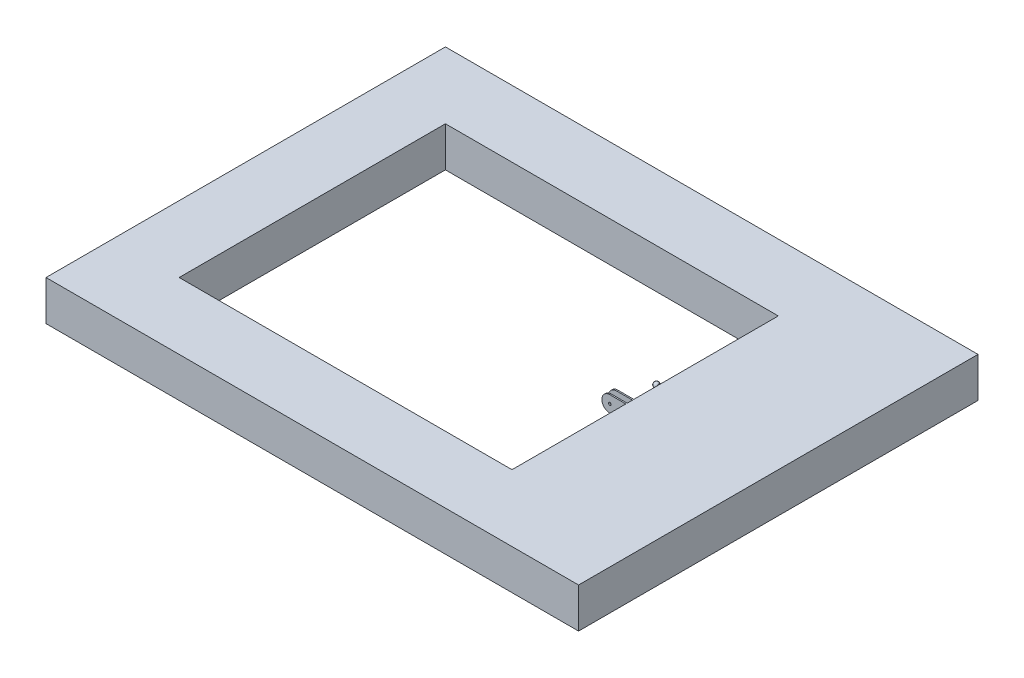
ISO-10303-21;
HEADER;
FILE_DESCRIPTION(('STEP AP214'),'2;1');
FILE_NAME('part.step','',(''),(''),'','','');
FILE_SCHEMA(('AUTOMOTIVE_DESIGN { 1 0 10303 214 1 1 1 1 }'));
ENDSEC;
DATA;
#1=APPLICATION_CONTEXT('core data for automotive mechanical design processes');
#2=APPLICATION_PROTOCOL_DEFINITION('international standard','automotive_design',2000,#1);
#3=PRODUCT_CONTEXT('',#1,'mechanical');
#4=PRODUCT('Part','Part','',(#3));
#5=PRODUCT_RELATED_PRODUCT_CATEGORY('part','',(#4));
#6=PRODUCT_DEFINITION_FORMATION('','',#4);
#7=PRODUCT_DEFINITION_CONTEXT('part definition',#1,'design');
#8=PRODUCT_DEFINITION('design','',#6,#7);
#9=PRODUCT_DEFINITION_SHAPE('','',#8);
#10=(LENGTH_UNIT() NAMED_UNIT(*) SI_UNIT(.MILLI.,.METRE.));
#11=(NAMED_UNIT(*) PLANE_ANGLE_UNIT() SI_UNIT($,.RADIAN.));
#12=(NAMED_UNIT(*) SI_UNIT($,.STERADIAN.) SOLID_ANGLE_UNIT());
#13=UNCERTAINTY_MEASURE_WITH_UNIT(LENGTH_MEASURE(1.E-05),#10,'distance_accuracy_value','');
#14=(GEOMETRIC_REPRESENTATION_CONTEXT(3) GLOBAL_UNCERTAINTY_ASSIGNED_CONTEXT((#13)) GLOBAL_UNIT_ASSIGNED_CONTEXT((#10,
#11,#12)) REPRESENTATION_CONTEXT('',''));
#15=CARTESIAN_POINT('',(0.,0.,0.));
#16=DIRECTION('',(0.,0.,1.));
#17=DIRECTION('',(1.,0.,0.));
#18=AXIS2_PLACEMENT_3D('',#15,#16,#17);
#19=CARTESIAN_POINT('',(0.,0.,3000.));
#20=DIRECTION('',(1.,0.,0.));
#21=DIRECTION('',(0.,0.,-1.));
#22=AXIS2_PLACEMENT_3D('',#19,#20,#21);
#23=PLANE('',#22);
#24=DIRECTION('',(0.,-1.,0.));
#25=VECTOR('',#24,1.);
#26=CARTESIAN_POINT('',(0.,0.,0.));
#27=LINE('',#26,#25);
#28=CARTESIAN_POINT('',(0.,300.,0.));
#29=VERTEX_POINT('',#28);
#30=CARTESIAN_POINT('',(0.,0.,0.));
#31=VERTEX_POINT('',#30);
#32=EDGE_CURVE('E300',#29,#31,#27,.T.);
#33=ORIENTED_EDGE('',*,*,#32,.T.);
#34=DIRECTION('',(0.,0.,-1.));
#35=VECTOR('',#34,1.);
#36=CARTESIAN_POINT('',(0.,0.,3000.));
#37=LINE('',#36,#35);
#38=CARTESIAN_POINT('',(0.,0.,3000.));
#39=VERTEX_POINT('',#38);
#40=EDGE_CURVE('E11',#39,#31,#37,.T.);
#41=ORIENTED_EDGE('',*,*,#40,.F.);
#42=DIRECTION('',(0.,-1.,0.));
#43=VECTOR('',#42,1.);
#44=CARTESIAN_POINT('',(0.,0.,3000.));
#45=LINE('',#44,#43);
#46=CARTESIAN_POINT('',(0.,300.,3000.));
#47=VERTEX_POINT('',#46);
#48=EDGE_CURVE('E320',#47,#39,#45,.T.);
#49=ORIENTED_EDGE('',*,*,#48,.F.);
#50=DIRECTION('',(0.,0.,-1.));
#51=VECTOR('',#50,1.);
#52=CARTESIAN_POINT('',(0.,300.,3000.));
#53=LINE('',#52,#51);
#54=EDGE_CURVE('E303',#47,#29,#53,.T.);
#55=ORIENTED_EDGE('',*,*,#54,.T.);
#56=EDGE_LOOP('',(#33,#41,#49,#55));
#57=FACE_BOUND('',#56,.T.);
#58=ADVANCED_FACE('F37',(#57),#23,.F.);
#59=CARTESIAN_POINT('',(0.,0.,3000.));
#60=DIRECTION('',(0.,1.,0.));
#61=DIRECTION('',(0.,0.,1.));
#62=AXIS2_PLACEMENT_3D('',#59,#60,#61);
#63=PLANE('',#62);
#64=DIRECTION('',(-1.,0.,0.));
#65=VECTOR('',#64,1.);
#66=CARTESIAN_POINT('',(0.,0.,500.));
#67=LINE('',#66,#65);
#68=CARTESIAN_POINT('',(3000.,0.,500.));
#69=VERTEX_POINT('',#68);
#70=CARTESIAN_POINT('',(500.,0.,500.));
#71=VERTEX_POINT('',#70);
#72=EDGE_CURVE('E311',#69,#71,#67,.T.);
#73=ORIENTED_EDGE('',*,*,#72,.T.);
#74=DIRECTION('',(0.,0.,1.));
#75=VECTOR('',#74,1.);
#76=CARTESIAN_POINT('',(500.,0.,3000.));
#77=LINE('',#76,#75);
#78=CARTESIAN_POINT('',(500.,0.,2500.));
#79=VERTEX_POINT('',#78);
#80=EDGE_CURVE('E307',#71,#79,#77,.T.);
#81=ORIENTED_EDGE('',*,*,#80,.T.);
#82=DIRECTION('',(1.,0.,0.));
#83=VECTOR('',#82,1.);
#84=CARTESIAN_POINT('',(0.,0.,2500.));
#85=LINE('',#84,#83);
#86=CARTESIAN_POINT('',(3000.,0.,2500.));
#87=VERTEX_POINT('',#86);
#88=EDGE_CURVE('E256',#79,#87,#85,.T.);
#89=ORIENTED_EDGE('',*,*,#88,.T.);
#90=DIRECTION('',(0.,0.,-1.));
#91=VECTOR('',#90,1.);
#92=CARTESIAN_POINT('',(3000.,0.,3000.));
#93=LINE('',#92,#91);
#94=EDGE_CURVE('E342',#87,#69,#93,.T.);
#95=ORIENTED_EDGE('',*,*,#94,.T.);
#96=EDGE_LOOP('',(#73,#81,#89,#95));
#97=FACE_BOUND('',#96,.T.);
#98=DIRECTION('',(1.,0.,0.));
#99=VECTOR('',#98,1.);
#100=CARTESIAN_POINT('',(0.,0.,0.));
#101=LINE('',#100,#99);
#102=CARTESIAN_POINT('',(4000.,0.,0.));
#103=VERTEX_POINT('',#102);
#104=EDGE_CURVE('E306',#31,#103,#101,.T.);
#105=ORIENTED_EDGE('',*,*,#104,.T.);
#106=DIRECTION('',(0.,0.,-1.));
#107=VECTOR('',#106,1.);
#108=CARTESIAN_POINT('',(4000.,0.,3000.));
#109=LINE('',#108,#107);
#110=CARTESIAN_POINT('',(4000.,0.,3000.));
#111=VERTEX_POINT('',#110);
#112=EDGE_CURVE('E44',#111,#103,#109,.T.);
#113=ORIENTED_EDGE('',*,*,#112,.F.);
#114=DIRECTION('',(1.,0.,0.));
#115=VECTOR('',#114,1.);
#116=CARTESIAN_POINT('',(0.,0.,3000.));
#117=LINE('',#116,#115);
#118=EDGE_CURVE('E336',#39,#111,#117,.T.);
#119=ORIENTED_EDGE('',*,*,#118,.F.);
#120=ORIENTED_EDGE('',*,*,#40,.T.);
#121=EDGE_LOOP('',(#105,#113,#119,#120));
#122=FACE_BOUND('',#121,.T.);
#123=ADVANCED_FACE('F289',(#97,#122),#63,.F.);
#124=CARTESIAN_POINT('',(4000.,0.,3000.));
#125=DIRECTION('',(-1.,0.,0.));
#126=DIRECTION('',(0.,0.,1.));
#127=AXIS2_PLACEMENT_3D('',#124,#125,#126);
#128=PLANE('',#127);
#129=DIRECTION('',(0.,1.,0.));
#130=VECTOR('',#129,1.);
#131=CARTESIAN_POINT('',(4000.,0.,0.));
#132=LINE('',#131,#130);
#133=CARTESIAN_POINT('',(4000.,300.,0.));
#134=VERTEX_POINT('',#133);
#135=EDGE_CURVE('E309',#103,#134,#132,.T.);
#136=ORIENTED_EDGE('',*,*,#135,.T.);
#137=DIRECTION('',(0.,0.,-1.));
#138=VECTOR('',#137,1.);
#139=CARTESIAN_POINT('',(4000.,300.,3000.));
#140=LINE('',#139,#138);
#141=CARTESIAN_POINT('',(4000.,300.,3000.));
#142=VERTEX_POINT('',#141);
#143=EDGE_CURVE('E322',#142,#134,#140,.T.);
#144=ORIENTED_EDGE('',*,*,#143,.F.);
#145=DIRECTION('',(0.,1.,0.));
#146=VECTOR('',#145,1.);
#147=CARTESIAN_POINT('',(4000.,0.,3000.));
#148=LINE('',#147,#146);
#149=EDGE_CURVE('E330',#111,#142,#148,.T.);
#150=ORIENTED_EDGE('',*,*,#149,.F.);
#151=ORIENTED_EDGE('',*,*,#112,.T.);
#152=EDGE_LOOP('',(#136,#144,#150,#151));
#153=FACE_BOUND('',#152,.T.);
#154=ADVANCED_FACE('F294',(#153),#128,.F.);
#155=CARTESIAN_POINT('',(0.,300.,3000.));
#156=DIRECTION('',(0.,-1.,0.));
#157=DIRECTION('',(0.,0.,-1.));
#158=AXIS2_PLACEMENT_3D('',#155,#156,#157);
#159=PLANE('',#158);
#160=DIRECTION('',(1.,0.,0.));
#161=VECTOR('',#160,1.);
#162=CARTESIAN_POINT('',(500.,300.,2500.));
#163=LINE('',#162,#161);
#164=CARTESIAN_POINT('',(500.,300.,2500.));
#165=VERTEX_POINT('',#164);
#166=CARTESIAN_POINT('',(3000.,300.,2500.));
#167=VERTEX_POINT('',#166);
#168=EDGE_CURVE('E168',#165,#167,#163,.T.);
#169=ORIENTED_EDGE('',*,*,#168,.F.);
#170=DIRECTION('',(0.,0.,1.));
#171=VECTOR('',#170,1.);
#172=CARTESIAN_POINT('',(500.,300.,500.));
#173=LINE('',#172,#171);
#174=CARTESIAN_POINT('',(500.,300.,500.));
#175=VERTEX_POINT('',#174);
#176=EDGE_CURVE('E171',#175,#165,#173,.T.);
#177=ORIENTED_EDGE('',*,*,#176,.F.);
#178=DIRECTION('',(-1.,0.,0.));
#179=VECTOR('',#178,1.);
#180=CARTESIAN_POINT('',(500.,300.,500.));
#181=LINE('',#180,#179);
#182=CARTESIAN_POINT('',(3000.,300.,500.));
#183=VERTEX_POINT('',#182);
#184=EDGE_CURVE('E165',#183,#175,#181,.T.);
#185=ORIENTED_EDGE('',*,*,#184,.F.);
#186=DIRECTION('',(0.,0.,-1.));
#187=VECTOR('',#186,1.);
#188=CARTESIAN_POINT('',(3000.,300.,500.));
#189=LINE('',#188,#187);
#190=CARTESIAN_POINT('',(3000.,300.,1385.));
#191=VERTEX_POINT('',#190);
#192=EDGE_CURVE('E157',#191,#183,#189,.T.);
#193=ORIENTED_EDGE('',*,*,#192,.F.);
#194=CARTESIAN_POINT('',(3000.,300.,1585.));
#195=VERTEX_POINT('',#194);
#196=EDGE_CURVE('E148',#195,#191,#189,.T.);
#197=ORIENTED_EDGE('',*,*,#196,.F.);
#198=DIRECTION('',(1.,0.,0.));
#199=VECTOR('',#198,1.);
#200=CARTESIAN_POINT('',(2880.,300.,1585.));
#201=LINE('',#200,#199);
#202=CARTESIAN_POINT('',(2880.,300.,1585.));
#203=VERTEX_POINT('',#202);
#204=EDGE_CURVE('E209',#203,#195,#201,.T.);
#205=ORIENTED_EDGE('',*,*,#204,.F.);
#206=DIRECTION('',(0.,0.,1.));
#207=VECTOR('',#206,1.);
#208=CARTESIAN_POINT('',(2880.,300.,1585.));
#209=LINE('',#208,#207);
#210=CARTESIAN_POINT('',(2880.,300.,1595.));
#211=VERTEX_POINT('',#210);
#212=EDGE_CURVE('E196',#203,#211,#209,.T.);
#213=ORIENTED_EDGE('',*,*,#212,.T.);
#214=DIRECTION('',(1.,0.,0.));
#215=VECTOR('',#214,1.);
#216=CARTESIAN_POINT('',(2880.,300.,1595.));
#217=LINE('',#216,#215);
#218=CARTESIAN_POINT('',(3000.,300.,1595.));
#219=VERTEX_POINT('',#218);
#220=EDGE_CURVE('E191',#211,#219,#217,.T.);
#221=ORIENTED_EDGE('',*,*,#220,.T.);
#222=CARTESIAN_POINT('',(3000.,300.,1635.));
#223=VERTEX_POINT('',#222);
#224=EDGE_CURVE('E156',#223,#219,#189,.T.);
#225=ORIENTED_EDGE('',*,*,#224,.F.);
#226=DIRECTION('',(1.,0.,0.));
#227=VECTOR('',#226,1.);
#228=CARTESIAN_POINT('',(2880.,300.,1635.));
#229=LINE('',#228,#227);
#230=CARTESIAN_POINT('',(2880.,300.,1635.));
#231=VERTEX_POINT('',#230);
#232=EDGE_CURVE('E222',#231,#223,#229,.T.);
#233=ORIENTED_EDGE('',*,*,#232,.F.);
#234=DIRECTION('',(0.,0.,1.));
#235=VECTOR('',#234,1.);
#236=CARTESIAN_POINT('',(2880.,300.,1635.));
#237=LINE('',#236,#235);
#238=CARTESIAN_POINT('',(2880.,300.,1645.));
#239=VERTEX_POINT('',#238);
#240=EDGE_CURVE('E230',#231,#239,#237,.T.);
#241=ORIENTED_EDGE('',*,*,#240,.T.);
#242=DIRECTION('',(1.,0.,0.));
#243=VECTOR('',#242,1.);
#244=CARTESIAN_POINT('',(2880.,300.,1645.));
#245=LINE('',#244,#243);
#246=CARTESIAN_POINT('',(3000.,300.,1645.));
#247=VERTEX_POINT('',#246);
#248=EDGE_CURVE('E219',#239,#247,#245,.T.);
#249=ORIENTED_EDGE('',*,*,#248,.T.);
#250=EDGE_CURVE('E169',#167,#247,#189,.T.);
#251=ORIENTED_EDGE('',*,*,#250,.F.);
#252=EDGE_LOOP('',(#169,#177,#185,#193,#197,#205,#213,#221,#225,#233,#241,#249,#251));
#253=FACE_BOUND('',#252,.T.);
#254=DIRECTION('',(-1.,0.,0.));
#255=VECTOR('',#254,1.);
#256=CARTESIAN_POINT('',(0.,300.,0.));
#257=LINE('',#256,#255);
#258=EDGE_CURVE('E318',#134,#29,#257,.T.);
#259=ORIENTED_EDGE('',*,*,#258,.T.);
#260=ORIENTED_EDGE('',*,*,#54,.F.);
#261=DIRECTION('',(-1.,0.,0.));
#262=VECTOR('',#261,1.);
#263=CARTESIAN_POINT('',(0.,300.,3000.));
#264=LINE('',#263,#262);
#265=EDGE_CURVE('E314',#142,#47,#264,.T.);
#266=ORIENTED_EDGE('',*,*,#265,.F.);
#267=ORIENTED_EDGE('',*,*,#143,.T.);
#268=EDGE_LOOP('',(#259,#260,#266,#267));
#269=FACE_BOUND('',#268,.T.);
#270=ADVANCED_FACE('F161',(#253,#269),#159,.F.);
#271=CARTESIAN_POINT('',(0.,0.,3000.));
#272=DIRECTION('',(0.,0.,-1.));
#273=DIRECTION('',(-1.,0.,0.));
#274=AXIS2_PLACEMENT_3D('',#271,#272,#273);
#275=PLANE('',#274);
#276=ORIENTED_EDGE('',*,*,#48,.T.);
#277=ORIENTED_EDGE('',*,*,#118,.T.);
#278=ORIENTED_EDGE('',*,*,#149,.T.);
#279=ORIENTED_EDGE('',*,*,#265,.T.);
#280=EDGE_LOOP('',(#276,#277,#278,#279));
#281=FACE_BOUND('',#280,.T.);
#282=ADVANCED_FACE('F352',(#281),#275,.F.);
#283=CARTESIAN_POINT('',(0.,0.,0.));
#284=DIRECTION('',(0.,0.,-1.));
#285=DIRECTION('',(-1.,0.,0.));
#286=AXIS2_PLACEMENT_3D('',#283,#284,#285);
#287=PLANE('',#286);
#288=ORIENTED_EDGE('',*,*,#32,.F.);
#289=ORIENTED_EDGE('',*,*,#258,.F.);
#290=ORIENTED_EDGE('',*,*,#135,.F.);
#291=ORIENTED_EDGE('',*,*,#104,.F.);
#292=EDGE_LOOP('',(#288,#289,#290,#291));
#293=FACE_BOUND('',#292,.T.);
#294=ADVANCED_FACE('F332',(#293),#287,.T.);
#295=CARTESIAN_POINT('',(500.,-2700.,500.));
#296=DIRECTION('',(-1.,0.,0.));
#297=DIRECTION('',(0.,0.,1.));
#298=AXIS2_PLACEMENT_3D('',#295,#296,#297);
#299=PLANE('',#298);
#300=DIRECTION('',(0.,1.,0.));
#301=VECTOR('',#300,1.);
#302=CARTESIAN_POINT('',(500.,-2700.,500.));
#303=LINE('',#302,#301);
#304=EDGE_CURVE('E252',#71,#175,#303,.T.);
#305=ORIENTED_EDGE('',*,*,#304,.T.);
#306=ORIENTED_EDGE('',*,*,#176,.T.);
#307=DIRECTION('',(0.,1.,0.));
#308=VECTOR('',#307,1.);
#309=CARTESIAN_POINT('',(500.,-2700.,2500.));
#310=LINE('',#309,#308);
#311=EDGE_CURVE('E176',#79,#165,#310,.T.);
#312=ORIENTED_EDGE('',*,*,#311,.F.);
#313=ORIENTED_EDGE('',*,*,#80,.F.);
#314=EDGE_LOOP('',(#305,#306,#312,#313));
#315=FACE_BOUND('',#314,.T.);
#316=ADVANCED_FACE('F249',(#315),#299,.F.);
#317=CARTESIAN_POINT('',(500.,-2700.,500.));
#318=DIRECTION('',(0.,0.,-1.));
#319=DIRECTION('',(-1.,0.,0.));
#320=AXIS2_PLACEMENT_3D('',#317,#318,#319);
#321=PLANE('',#320);
#322=DIRECTION('',(0.,1.,0.));
#323=VECTOR('',#322,1.);
#324=CARTESIAN_POINT('',(3000.,-2700.,500.));
#325=LINE('',#324,#323);
#326=EDGE_CURVE('E347',#69,#183,#325,.T.);
#327=ORIENTED_EDGE('',*,*,#326,.T.);
#328=ORIENTED_EDGE('',*,*,#184,.T.);
#329=ORIENTED_EDGE('',*,*,#304,.F.);
#330=ORIENTED_EDGE('',*,*,#72,.F.);
#331=EDGE_LOOP('',(#327,#328,#329,#330));
#332=FACE_BOUND('',#331,.T.);
#333=ADVANCED_FACE('F350',(#332),#321,.F.);
#334=CARTESIAN_POINT('',(3000.,-2700.,500.));
#335=DIRECTION('',(1.,0.,0.));
#336=DIRECTION('',(0.,0.,-1.));
#337=AXIS2_PLACEMENT_3D('',#334,#335,#336);
#338=PLANE('',#337);
#339=ORIENTED_EDGE('',*,*,#196,.T.);
#340=CARTESIAN_POINT('',(3000.,280.,1385.));
#341=DIRECTION('',(1.,0.,0.));
#342=DIRECTION('',(0.,0.,-1.));
#343=AXIS2_PLACEMENT_3D('',#340,#341,#342);
#344=CIRCLE('',#343,20.);
#345=EDGE_CURVE('E152',#191,#191,#344,.T.);
#346=ORIENTED_EDGE('',*,*,#345,.T.);
#347=ORIENTED_EDGE('',*,*,#192,.T.);
#348=ORIENTED_EDGE('',*,*,#326,.F.);
#349=ORIENTED_EDGE('',*,*,#94,.F.);
#350=DIRECTION('',(0.,1.,0.));
#351=VECTOR('',#350,1.);
#352=CARTESIAN_POINT('',(3000.,-2700.,2500.));
#353=LINE('',#352,#351);
#354=EDGE_CURVE('E257',#87,#167,#353,.T.);
#355=ORIENTED_EDGE('',*,*,#354,.T.);
#356=ORIENTED_EDGE('',*,*,#250,.T.);
#357=DIRECTION('',(0.,-1.,0.));
#358=VECTOR('',#357,1.);
#359=CARTESIAN_POINT('',(3000.,300.,1645.));
#360=LINE('',#359,#358);
#361=CARTESIAN_POINT('',(3000.,180.,1645.));
#362=VERTEX_POINT('',#361);
#363=EDGE_CURVE('E233',#247,#362,#360,.T.);
#364=ORIENTED_EDGE('',*,*,#363,.T.);
#365=DIRECTION('',(0.,0.,1.));
#366=VECTOR('',#365,1.);
#367=CARTESIAN_POINT('',(3000.,180.,1635.));
#368=LINE('',#367,#366);
#369=CARTESIAN_POINT('',(3000.,180.,1635.));
#370=VERTEX_POINT('',#369);
#371=EDGE_CURVE('E243',#370,#362,#368,.T.);
#372=ORIENTED_EDGE('',*,*,#371,.F.);
#373=DIRECTION('',(0.,-1.,0.));
#374=VECTOR('',#373,1.);
#375=CARTESIAN_POINT('',(3000.,300.,1635.));
#376=LINE('',#375,#374);
#377=EDGE_CURVE('E181',#223,#370,#376,.T.);
#378=ORIENTED_EDGE('',*,*,#377,.F.);
#379=ORIENTED_EDGE('',*,*,#224,.T.);
#380=DIRECTION('',(0.,-1.,0.));
#381=VECTOR('',#380,1.);
#382=CARTESIAN_POINT('',(3000.,300.,1595.));
#383=LINE('',#382,#381);
#384=CARTESIAN_POINT('',(3000.,180.,1595.));
#385=VERTEX_POINT('',#384);
#386=EDGE_CURVE('E179',#219,#385,#383,.T.);
#387=ORIENTED_EDGE('',*,*,#386,.T.);
#388=DIRECTION('',(0.,0.,1.));
#389=VECTOR('',#388,1.);
#390=CARTESIAN_POINT('',(3000.,180.,1585.));
#391=LINE('',#390,#389);
#392=CARTESIAN_POINT('',(3000.,180.,1585.));
#393=VERTEX_POINT('',#392);
#394=EDGE_CURVE('E51',#393,#385,#391,.T.);
#395=ORIENTED_EDGE('',*,*,#394,.F.);
#396=DIRECTION('',(0.,-1.,0.));
#397=VECTOR('',#396,1.);
#398=CARTESIAN_POINT('',(3000.,300.,1585.));
#399=LINE('',#398,#397);
#400=EDGE_CURVE('E55',#195,#393,#399,.T.);
#401=ORIENTED_EDGE('',*,*,#400,.F.);
#402=EDGE_LOOP('',(#339,#346,#347,#348,#349,#355,#356,#364,#372,#378,#379,#387,#395,#401));
#403=FACE_BOUND('',#402,.T.);
#404=ADVANCED_FACE('F150',(#403),#338,.F.);
#405=CARTESIAN_POINT('',(500.,-2700.,2500.));
#406=DIRECTION('',(0.,0.,1.));
#407=DIRECTION('',(1.,0.,0.));
#408=AXIS2_PLACEMENT_3D('',#405,#406,#407);
#409=PLANE('',#408);
#410=ORIENTED_EDGE('',*,*,#311,.T.);
#411=ORIENTED_EDGE('',*,*,#168,.T.);
#412=ORIENTED_EDGE('',*,*,#354,.F.);
#413=ORIENTED_EDGE('',*,*,#88,.F.);
#414=EDGE_LOOP('',(#410,#411,#412,#413));
#415=FACE_BOUND('',#414,.T.);
#416=ADVANCED_FACE('F254',(#415),#409,.F.);
#417=CARTESIAN_POINT('',(2880.,240.,1635.));
#418=DIRECTION('',(0.,0.,-1.));
#419=DIRECTION('',(-1.,0.,0.));
#420=AXIS2_PLACEMENT_3D('',#417,#418,#419);
#421=PLANE('',#420);
#422=ORIENTED_EDGE('',*,*,#232,.T.);
#423=ORIENTED_EDGE('',*,*,#377,.T.);
#424=DIRECTION('',(-1.,0.,0.));
#425=VECTOR('',#424,1.);
#426=CARTESIAN_POINT('',(3000.,180.,1635.));
#427=LINE('',#426,#425);
#428=CARTESIAN_POINT('',(2880.,180.,1635.));
#429=VERTEX_POINT('',#428);
#430=EDGE_CURVE('E226',#370,#429,#427,.T.);
#431=ORIENTED_EDGE('',*,*,#430,.T.);
#432=CARTESIAN_POINT('',(2880.,240.,1635.));
#433=DIRECTION('',(0.,0.,-1.));
#434=DIRECTION('',(-1.,0.,0.));
#435=AXIS2_PLACEMENT_3D('',#432,#433,#434);
#436=CIRCLE('',#435,60.);
#437=EDGE_CURVE('E228',#429,#231,#436,.T.);
#438=ORIENTED_EDGE('',*,*,#437,.T.);
#439=EDGE_LOOP('',(#422,#423,#431,#438));
#440=FACE_BOUND('',#439,.T.);
#441=CARTESIAN_POINT('',(2880.,240.,1635.));
#442=DIRECTION('',(0.,0.,-1.));
#443=DIRECTION('',(-1.,0.,0.));
#444=AXIS2_PLACEMENT_3D('',#441,#442,#443);
#445=CIRCLE('',#444,9.99999999999964);
#446=CARTESIAN_POINT('',(2870.,240.,1635.));
#447=VERTEX_POINT('',#446);
#448=EDGE_CURVE('E216',#447,#447,#445,.T.);
#449=ORIENTED_EDGE('',*,*,#448,.F.);
#450=EDGE_LOOP('',(#449));
#451=FACE_BOUND('',#450,.T.);
#452=ADVANCED_FACE('F272',(#440,#451),#421,.T.);
#453=CARTESIAN_POINT('',(2880.,240.,1645.));
#454=DIRECTION('',(0.,0.,-1.));
#455=DIRECTION('',(-1.,0.,0.));
#456=AXIS2_PLACEMENT_3D('',#453,#454,#455);
#457=PLANE('',#456);
#458=ORIENTED_EDGE('',*,*,#248,.F.);
#459=CARTESIAN_POINT('',(2880.,240.,1645.));
#460=DIRECTION('',(0.,0.,-1.));
#461=DIRECTION('',(-1.,0.,0.));
#462=AXIS2_PLACEMENT_3D('',#459,#460,#461);
#463=CIRCLE('',#462,60.);
#464=CARTESIAN_POINT('',(2880.,180.,1645.));
#465=VERTEX_POINT('',#464);
#466=EDGE_CURVE('E224',#465,#239,#463,.T.);
#467=ORIENTED_EDGE('',*,*,#466,.F.);
#468=DIRECTION('',(-1.,0.,0.));
#469=VECTOR('',#468,1.);
#470=CARTESIAN_POINT('',(3000.,180.,1645.));
#471=LINE('',#470,#469);
#472=EDGE_CURVE('E235',#362,#465,#471,.T.);
#473=ORIENTED_EDGE('',*,*,#472,.F.);
#474=ORIENTED_EDGE('',*,*,#363,.F.);
#475=EDGE_LOOP('',(#458,#467,#473,#474));
#476=FACE_BOUND('',#475,.T.);
#477=CARTESIAN_POINT('',(2880.,240.,1645.));
#478=DIRECTION('',(0.,0.,-1.));
#479=DIRECTION('',(-1.,0.,0.));
#480=AXIS2_PLACEMENT_3D('',#477,#478,#479);
#481=CIRCLE('',#480,9.99999999999964);
#482=CARTESIAN_POINT('',(2870.,240.,1645.));
#483=VERTEX_POINT('',#482);
#484=EDGE_CURVE('E215',#483,#483,#481,.T.);
#485=ORIENTED_EDGE('',*,*,#484,.T.);
#486=EDGE_LOOP('',(#485));
#487=FACE_BOUND('',#486,.T.);
#488=ADVANCED_FACE('F263',(#476,#487),#457,.F.);
#489=CARTESIAN_POINT('',(3000.,180.,1635.));
#490=DIRECTION('',(0.,1.,0.));
#491=DIRECTION('',(0.,0.,1.));
#492=AXIS2_PLACEMENT_3D('',#489,#490,#491);
#493=PLANE('',#492);
#494=ORIENTED_EDGE('',*,*,#472,.T.);
#495=DIRECTION('',(0.,0.,1.));
#496=VECTOR('',#495,1.);
#497=CARTESIAN_POINT('',(2880.,180.,1635.));
#498=LINE('',#497,#496);
#499=EDGE_CURVE('E240',#429,#465,#498,.T.);
#500=ORIENTED_EDGE('',*,*,#499,.F.);
#501=ORIENTED_EDGE('',*,*,#430,.F.);
#502=ORIENTED_EDGE('',*,*,#371,.T.);
#503=EDGE_LOOP('',(#494,#500,#501,#502));
#504=FACE_BOUND('',#503,.T.);
#505=ADVANCED_FACE('F268',(#504),#493,.F.);
#506=CARTESIAN_POINT('',(2880.,240.,1635.));
#507=DIRECTION('',(0.,0.,1.));
#508=DIRECTION('',(1.,0.,0.));
#509=AXIS2_PLACEMENT_3D('',#506,#507,#508);
#510=CYLINDRICAL_SURFACE('',#509,60.);
#511=ORIENTED_EDGE('',*,*,#466,.T.);
#512=ORIENTED_EDGE('',*,*,#240,.F.);
#513=ORIENTED_EDGE('',*,*,#437,.F.);
#514=ORIENTED_EDGE('',*,*,#499,.T.);
#515=EDGE_LOOP('',(#511,#512,#513,#514));
#516=FACE_BOUND('',#515,.T.);
#517=ADVANCED_FACE('F275',(#516),#510,.T.);
#518=CARTESIAN_POINT('',(2880.,240.,1635.));
#519=DIRECTION('',(0.,0.,1.));
#520=DIRECTION('',(1.,0.,0.));
#521=AXIS2_PLACEMENT_3D('',#518,#519,#520);
#522=CYLINDRICAL_SURFACE('',#521,9.99999999999964);
#523=ORIENTED_EDGE('',*,*,#448,.T.);
#524=EDGE_LOOP('',(#523));
#525=FACE_BOUND('',#524,.T.);
#526=ORIENTED_EDGE('',*,*,#484,.F.);
#527=EDGE_LOOP('',(#526));
#528=FACE_BOUND('',#527,.T.);
#529=ADVANCED_FACE('F277',(#525,#528),#522,.F.);
#530=CARTESIAN_POINT('',(2880.,240.,1585.));
#531=DIRECTION('',(0.,0.,-1.));
#532=DIRECTION('',(-1.,0.,0.));
#533=AXIS2_PLACEMENT_3D('',#530,#531,#532);
#534=PLANE('',#533);
#535=ORIENTED_EDGE('',*,*,#204,.T.);
#536=ORIENTED_EDGE('',*,*,#400,.T.);
#537=DIRECTION('',(-1.,0.,0.));
#538=VECTOR('',#537,1.);
#539=CARTESIAN_POINT('',(3000.,180.,1585.));
#540=LINE('',#539,#538);
#541=CARTESIAN_POINT('',(2880.,180.,1585.));
#542=VERTEX_POINT('',#541);
#543=EDGE_CURVE('E522',#393,#542,#540,.T.);
#544=ORIENTED_EDGE('',*,*,#543,.T.);
#545=CARTESIAN_POINT('',(2880.,240.,1585.));
#546=DIRECTION('',(0.,0.,-1.));
#547=DIRECTION('',(-1.,0.,0.));
#548=AXIS2_PLACEMENT_3D('',#545,#546,#547);
#549=CIRCLE('',#548,60.);
#550=EDGE_CURVE('E203',#542,#203,#549,.T.);
#551=ORIENTED_EDGE('',*,*,#550,.T.);
#552=EDGE_LOOP('',(#535,#536,#544,#551));
#553=FACE_BOUND('',#552,.T.);
#554=CARTESIAN_POINT('',(2880.,240.,1585.));
#555=DIRECTION('',(0.,0.,-1.));
#556=DIRECTION('',(-1.,0.,0.));
#557=AXIS2_PLACEMENT_3D('',#554,#555,#556);
#558=CIRCLE('',#557,9.99999999999964);
#559=CARTESIAN_POINT('',(2870.,240.,1585.));
#560=VERTEX_POINT('',#559);
#561=EDGE_CURVE('E197',#560,#560,#558,.T.);
#562=ORIENTED_EDGE('',*,*,#561,.F.);
#563=EDGE_LOOP('',(#562));
#564=FACE_BOUND('',#563,.T.);
#565=ADVANCED_FACE('F283',(#553,#564),#534,.T.);
#566=CARTESIAN_POINT('',(2880.,240.,1595.));
#567=DIRECTION('',(0.,0.,-1.));
#568=DIRECTION('',(-1.,0.,0.));
#569=AXIS2_PLACEMENT_3D('',#566,#567,#568);
#570=PLANE('',#569);
#571=ORIENTED_EDGE('',*,*,#220,.F.);
#572=CARTESIAN_POINT('',(2880.,240.,1595.));
#573=DIRECTION('',(0.,0.,-1.));
#574=DIRECTION('',(-1.,0.,0.));
#575=AXIS2_PLACEMENT_3D('',#572,#573,#574);
#576=CIRCLE('',#575,60.);
#577=CARTESIAN_POINT('',(2880.,180.,1595.));
#578=VERTEX_POINT('',#577);
#579=EDGE_CURVE('E207',#578,#211,#576,.T.);
#580=ORIENTED_EDGE('',*,*,#579,.F.);
#581=DIRECTION('',(-1.,0.,0.));
#582=VECTOR('',#581,1.);
#583=CARTESIAN_POINT('',(3000.,180.,1595.));
#584=LINE('',#583,#582);
#585=EDGE_CURVE('E192',#385,#578,#584,.T.);
#586=ORIENTED_EDGE('',*,*,#585,.F.);
#587=ORIENTED_EDGE('',*,*,#386,.F.);
#588=EDGE_LOOP('',(#571,#580,#586,#587));
#589=FACE_BOUND('',#588,.T.);
#590=CARTESIAN_POINT('',(2880.,240.,1595.));
#591=DIRECTION('',(0.,0.,-1.));
#592=DIRECTION('',(-1.,0.,0.));
#593=AXIS2_PLACEMENT_3D('',#590,#591,#592);
#594=CIRCLE('',#593,9.99999999999964);
#595=CARTESIAN_POINT('',(2870.,240.,1595.));
#596=VERTEX_POINT('',#595);
#597=EDGE_CURVE('E200',#596,#596,#594,.T.);
#598=ORIENTED_EDGE('',*,*,#597,.T.);
#599=EDGE_LOOP('',(#598));
#600=FACE_BOUND('',#599,.T.);
#601=ADVANCED_FACE('F188',(#589,#600),#570,.F.);
#602=CARTESIAN_POINT('',(3000.,180.,1585.));
#603=DIRECTION('',(0.,1.,0.));
#604=DIRECTION('',(0.,0.,1.));
#605=AXIS2_PLACEMENT_3D('',#602,#603,#604);
#606=PLANE('',#605);
#607=ORIENTED_EDGE('',*,*,#585,.T.);
#608=DIRECTION('',(0.,0.,1.));
#609=VECTOR('',#608,1.);
#610=CARTESIAN_POINT('',(2880.,180.,1585.));
#611=LINE('',#610,#609);
#612=EDGE_CURVE('E211',#542,#578,#611,.T.);
#613=ORIENTED_EDGE('',*,*,#612,.F.);
#614=ORIENTED_EDGE('',*,*,#543,.F.);
#615=ORIENTED_EDGE('',*,*,#394,.T.);
#616=EDGE_LOOP('',(#607,#613,#614,#615));
#617=FACE_BOUND('',#616,.T.);
#618=ADVANCED_FACE('F450',(#617),#606,.F.);
#619=CARTESIAN_POINT('',(2880.,240.,1585.));
#620=DIRECTION('',(0.,0.,1.));
#621=DIRECTION('',(1.,0.,0.));
#622=AXIS2_PLACEMENT_3D('',#619,#620,#621);
#623=CYLINDRICAL_SURFACE('',#622,60.);
#624=ORIENTED_EDGE('',*,*,#579,.T.);
#625=ORIENTED_EDGE('',*,*,#212,.F.);
#626=ORIENTED_EDGE('',*,*,#550,.F.);
#627=ORIENTED_EDGE('',*,*,#612,.T.);
#628=EDGE_LOOP('',(#624,#625,#626,#627));
#629=FACE_BOUND('',#628,.T.);
#630=ADVANCED_FACE('F459',(#629),#623,.T.);
#631=CARTESIAN_POINT('',(2880.,240.,1585.));
#632=DIRECTION('',(0.,0.,1.));
#633=DIRECTION('',(1.,0.,0.));
#634=AXIS2_PLACEMENT_3D('',#631,#632,#633);
#635=CYLINDRICAL_SURFACE('',#634,9.99999999999964);
#636=ORIENTED_EDGE('',*,*,#561,.T.);
#637=EDGE_LOOP('',(#636));
#638=FACE_BOUND('',#637,.T.);
#639=ORIENTED_EDGE('',*,*,#597,.F.);
#640=EDGE_LOOP('',(#639));
#641=FACE_BOUND('',#640,.T.);
#642=ADVANCED_FACE('F469',(#638,#641),#635,.F.);
#643=CARTESIAN_POINT('',(2986.04327559136,280.,1385.));
#644=DIRECTION('',(1.,0.,0.));
#645=DIRECTION('',(0.,0.,-1.));
#646=AXIS2_PLACEMENT_3D('',#643,#644,#645);
#647=CONICAL_SURFACE('',#646,11.9420814056677,0.523598775598304);
#648=ORIENTED_EDGE('',*,*,#345,.F.);
#649=EDGE_LOOP('',(#648));
#650=FACE_BOUND('',#649,.T.);
#651=CARTESIAN_POINT('',(2986.04327559136,280.,1385.));
#652=DIRECTION('',(1.,0.,0.));
#653=DIRECTION('',(0.,0.,-1.));
#654=AXIS2_PLACEMENT_3D('',#651,#652,#653);
#655=CIRCLE('',#654,11.9420814056677);
#656=CARTESIAN_POINT('',(2986.04327559136,280.,1373.05791859433));
#657=VERTEX_POINT('',#656);
#658=EDGE_CURVE('E514',#657,#657,#655,.T.);
#659=ORIENTED_EDGE('',*,*,#658,.T.);
#660=EDGE_LOOP('',(#659));
#661=FACE_BOUND('',#660,.T.);
#662=ADVANCED_FACE('F479',(#650,#661),#647,.T.);
#663=CARTESIAN_POINT('',(2970.,280.,1385.));
#664=DIRECTION('',(1.,0.,0.));
#665=DIRECTION('',(0.,1.,0.));
#666=AXIS2_PLACEMENT_3D('',#663,#664,#665);
#667=SPHERICAL_SURFACE('',#666,20.);
#668=ORIENTED_EDGE('',*,*,#658,.F.);
#669=EDGE_LOOP('',(#668));
#670=FACE_BOUND('',#669,.T.);
#671=ADVANCED_FACE('F498',(#670),#667,.T.);
#672=CLOSED_SHELL('',(#58,#123,#154,#270,#282,#294,#316,#333,#404,#416,#452,#488,#505,#517,#529,
#565,#601,#618,#630,#642,#662,#671));
#673=MANIFOLD_SOLID_BREP('B2',#672);
#674=ADVANCED_BREP_SHAPE_REPRESENTATION('',(#18,#673),#14);
#675=SHAPE_DEFINITION_REPRESENTATION(#9,#674);
ENDSEC;
END-ISO-10303-21;
